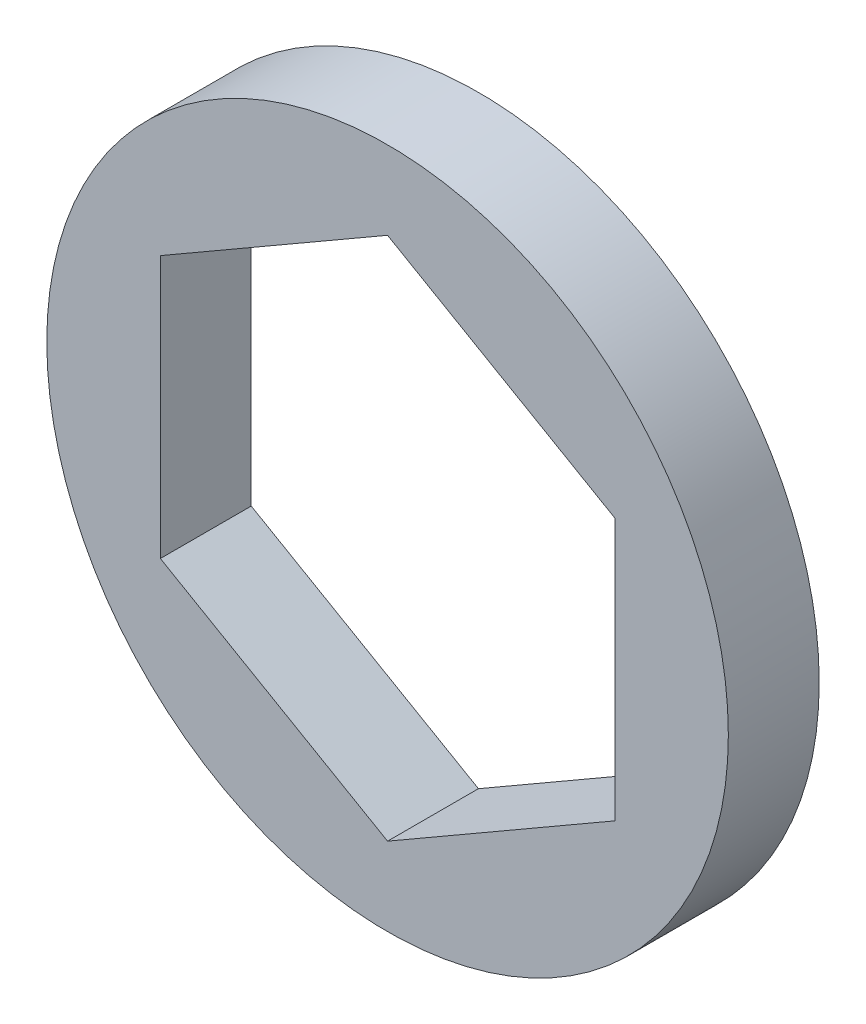
ISO-10303-21;
HEADER;
FILE_DESCRIPTION(('STEP AP214'),'2;1');
FILE_NAME('part.step','',(''),(''),'','','');
FILE_SCHEMA(('AUTOMOTIVE_DESIGN { 1 0 10303 214 1 1 1 1 }'));
ENDSEC;
DATA;
#1=APPLICATION_CONTEXT('core data for automotive mechanical design processes');
#2=APPLICATION_PROTOCOL_DEFINITION('international standard','automotive_design',2000,#1);
#3=PRODUCT_CONTEXT('',#1,'mechanical');
#4=PRODUCT('Part','Part','',(#3));
#5=PRODUCT_RELATED_PRODUCT_CATEGORY('part','',(#4));
#6=PRODUCT_DEFINITION_FORMATION('','',#4);
#7=PRODUCT_DEFINITION_CONTEXT('part definition',#1,'design');
#8=PRODUCT_DEFINITION('design','',#6,#7);
#9=PRODUCT_DEFINITION_SHAPE('','',#8);
#10=(LENGTH_UNIT() NAMED_UNIT(*) SI_UNIT(.MILLI.,.METRE.));
#11=(NAMED_UNIT(*) PLANE_ANGLE_UNIT() SI_UNIT($,.RADIAN.));
#12=(NAMED_UNIT(*) SI_UNIT($,.STERADIAN.) SOLID_ANGLE_UNIT());
#13=UNCERTAINTY_MEASURE_WITH_UNIT(LENGTH_MEASURE(1.E-05),#10,'distance_accuracy_value','');
#14=(GEOMETRIC_REPRESENTATION_CONTEXT(3) GLOBAL_UNCERTAINTY_ASSIGNED_CONTEXT((#13)) GLOBAL_UNIT_ASSIGNED_CONTEXT((#10,
#11,#12)) REPRESENTATION_CONTEXT('',''));
#15=CARTESIAN_POINT('',(0.,0.,0.));
#16=DIRECTION('',(0.,0.,1.));
#17=DIRECTION('',(1.,0.,0.));
#18=AXIS2_PLACEMENT_3D('',#15,#16,#17);
#19=CARTESIAN_POINT('',(114.3,627.126,2.54));
#20=DIRECTION('',(0.,0.,1.));
#21=DIRECTION('',(1.,0.,0.));
#22=AXIS2_PLACEMENT_3D('',#19,#20,#21);
#23=PLANE('',#22);
#24=CARTESIAN_POINT('',(114.3,627.126,2.54));
#25=DIRECTION('',(0.,0.,1.));
#26=DIRECTION('',(1.,0.,0.));
#27=AXIS2_PLACEMENT_3D('',#24,#25,#26);
#28=CIRCLE('',#27,9.525);
#29=CARTESIAN_POINT('',(123.825,627.126,2.54));
#30=VERTEX_POINT('',#29);
#31=EDGE_CURVE('E11',#30,#30,#28,.T.);
#32=ORIENTED_EDGE('',*,*,#31,.T.);
#33=EDGE_LOOP('',(#32));
#34=FACE_BOUND('',#33,.T.);
#35=DIRECTION('',(-0.866025403784437,-0.500000000000002,0.));
#36=VECTOR('',#35,1.);
#37=CARTESIAN_POINT('',(114.3,634.458348418708,2.54));
#38=LINE('',#37,#36);
#39=CARTESIAN_POINT('',(114.3,634.458348418708,2.54));
#40=VERTEX_POINT('',#39);
#41=CARTESIAN_POINT('',(107.95,630.792174209354,2.54));
#42=VERTEX_POINT('',#41);
#43=EDGE_CURVE('E100',#40,#42,#38,.T.);
#44=ORIENTED_EDGE('',*,*,#43,.F.);
#45=DIRECTION('',(-0.866025403784435,0.500000000000007,0.));
#46=VECTOR('',#45,1.);
#47=CARTESIAN_POINT('',(120.65,630.792174209354,2.54));
#48=LINE('',#47,#46);
#49=CARTESIAN_POINT('',(120.65,630.792174209354,2.54));
#50=VERTEX_POINT('',#49);
#51=EDGE_CURVE('E92',#50,#40,#48,.T.);
#52=ORIENTED_EDGE('',*,*,#51,.F.);
#53=DIRECTION('',(0.,1.,0.));
#54=VECTOR('',#53,1.);
#55=CARTESIAN_POINT('',(120.65,623.459825790646,2.54));
#56=LINE('',#55,#54);
#57=CARTESIAN_POINT('',(120.65,623.459825790646,2.54));
#58=VERTEX_POINT('',#57);
#59=EDGE_CURVE('E120',#58,#50,#56,.T.);
#60=ORIENTED_EDGE('',*,*,#59,.F.);
#61=DIRECTION('',(0.866025403784441,0.499999999999995,0.));
#62=VECTOR('',#61,1.);
#63=CARTESIAN_POINT('',(114.3,619.793651581292,2.54));
#64=LINE('',#63,#62);
#65=CARTESIAN_POINT('',(114.3,619.793651581292,2.54));
#66=VERTEX_POINT('',#65);
#67=EDGE_CURVE('E118',#66,#58,#64,.T.);
#68=ORIENTED_EDGE('',*,*,#67,.F.);
#69=DIRECTION('',(0.866025403784443,-0.499999999999992,0.));
#70=VECTOR('',#69,1.);
#71=CARTESIAN_POINT('',(107.95,623.459825790646,2.54));
#72=LINE('',#71,#70);
#73=CARTESIAN_POINT('',(107.95,623.459825790646,2.54));
#74=VERTEX_POINT('',#73);
#75=EDGE_CURVE('E114',#74,#66,#72,.T.);
#76=ORIENTED_EDGE('',*,*,#75,.F.);
#77=DIRECTION('',(0.,-1.,0.));
#78=VECTOR('',#77,1.);
#79=CARTESIAN_POINT('',(107.95,630.792174209354,2.54));
#80=LINE('',#79,#78);
#81=EDGE_CURVE('E112',#42,#74,#80,.T.);
#82=ORIENTED_EDGE('',*,*,#81,.F.);
#83=EDGE_LOOP('',(#44,#52,#60,#68,#76,#82));
#84=FACE_BOUND('',#83,.T.);
#85=ADVANCED_FACE('F39',(#34,#84),#23,.T.);
#86=CARTESIAN_POINT('',(114.3,627.126,0.));
#87=DIRECTION('',(0.,0.,1.));
#88=DIRECTION('',(1.,0.,0.));
#89=AXIS2_PLACEMENT_3D('',#86,#87,#88);
#90=PLANE('',#89);
#91=CARTESIAN_POINT('',(114.3,627.126,0.));
#92=DIRECTION('',(0.,0.,1.));
#93=DIRECTION('',(1.,0.,0.));
#94=AXIS2_PLACEMENT_3D('',#91,#92,#93);
#95=CIRCLE('',#94,9.525);
#96=CARTESIAN_POINT('',(123.825,627.126,0.));
#97=VERTEX_POINT('',#96);
#98=EDGE_CURVE('E43',#97,#97,#95,.T.);
#99=ORIENTED_EDGE('',*,*,#98,.F.);
#100=EDGE_LOOP('',(#99));
#101=FACE_BOUND('',#100,.T.);
#102=DIRECTION('',(-0.866025403784435,0.500000000000007,0.));
#103=VECTOR('',#102,1.);
#104=CARTESIAN_POINT('',(120.65,630.792174209354,0.));
#105=LINE('',#104,#103);
#106=CARTESIAN_POINT('',(120.65,630.792174209354,0.));
#107=VERTEX_POINT('',#106);
#108=CARTESIAN_POINT('',(114.3,634.458348418708,0.));
#109=VERTEX_POINT('',#108);
#110=EDGE_CURVE('E62',#107,#109,#105,.T.);
#111=ORIENTED_EDGE('',*,*,#110,.T.);
#112=DIRECTION('',(-0.866025403784437,-0.500000000000002,0.));
#113=VECTOR('',#112,1.);
#114=CARTESIAN_POINT('',(114.3,634.458348418708,0.));
#115=LINE('',#114,#113);
#116=CARTESIAN_POINT('',(107.95,630.792174209354,0.));
#117=VERTEX_POINT('',#116);
#118=EDGE_CURVE('E107',#109,#117,#115,.T.);
#119=ORIENTED_EDGE('',*,*,#118,.T.);
#120=DIRECTION('',(0.,-1.,0.));
#121=VECTOR('',#120,1.);
#122=CARTESIAN_POINT('',(107.95,630.792174209354,0.));
#123=LINE('',#122,#121);
#124=CARTESIAN_POINT('',(107.95,623.459825790646,0.));
#125=VERTEX_POINT('',#124);
#126=EDGE_CURVE('E124',#117,#125,#123,.T.);
#127=ORIENTED_EDGE('',*,*,#126,.T.);
#128=DIRECTION('',(0.866025403784443,-0.499999999999992,0.));
#129=VECTOR('',#128,1.);
#130=CARTESIAN_POINT('',(107.95,623.459825790646,0.));
#131=LINE('',#130,#129);
#132=CARTESIAN_POINT('',(114.3,619.793651581292,0.));
#133=VERTEX_POINT('',#132);
#134=EDGE_CURVE('E127',#125,#133,#131,.T.);
#135=ORIENTED_EDGE('',*,*,#134,.T.);
#136=DIRECTION('',(0.866025403784441,0.499999999999995,0.));
#137=VECTOR('',#136,1.);
#138=CARTESIAN_POINT('',(114.3,619.793651581292,0.));
#139=LINE('',#138,#137);
#140=CARTESIAN_POINT('',(120.65,623.459825790646,0.));
#141=VERTEX_POINT('',#140);
#142=EDGE_CURVE('E130',#133,#141,#139,.T.);
#143=ORIENTED_EDGE('',*,*,#142,.T.);
#144=DIRECTION('',(0.,1.,0.));
#145=VECTOR('',#144,1.);
#146=CARTESIAN_POINT('',(120.65,623.459825790646,0.));
#147=LINE('',#146,#145);
#148=EDGE_CURVE('E101',#141,#107,#147,.T.);
#149=ORIENTED_EDGE('',*,*,#148,.T.);
#150=EDGE_LOOP('',(#111,#119,#127,#135,#143,#149));
#151=FACE_BOUND('',#150,.T.);
#152=ADVANCED_FACE('F147',(#101,#151),#90,.F.);
#153=CARTESIAN_POINT('',(114.3,627.126,2.54));
#154=DIRECTION('',(0.,0.,-1.));
#155=DIRECTION('',(-1.,0.,0.));
#156=AXIS2_PLACEMENT_3D('',#153,#154,#155);
#157=CYLINDRICAL_SURFACE('',#156,9.525);
#158=ORIENTED_EDGE('',*,*,#31,.F.);
#159=EDGE_LOOP('',(#158));
#160=FACE_BOUND('',#159,.T.);
#161=ORIENTED_EDGE('',*,*,#98,.T.);
#162=EDGE_LOOP('',(#161));
#163=FACE_BOUND('',#162,.T.);
#164=ADVANCED_FACE('F41',(#160,#163),#157,.T.);
#165=CARTESIAN_POINT('',(120.65,630.792174209354,2.54));
#166=DIRECTION('',(-0.500000000000007,-0.866025403784435,0.));
#167=DIRECTION('',(0.866025403784435,-0.500000000000007,0.));
#168=AXIS2_PLACEMENT_3D('',#165,#166,#167);
#169=PLANE('',#168);
#170=ORIENTED_EDGE('',*,*,#110,.F.);
#171=DIRECTION('',(0.,0.,-1.));
#172=VECTOR('',#171,1.);
#173=CARTESIAN_POINT('',(120.65,630.792174209354,2.54));
#174=LINE('',#173,#172);
#175=EDGE_CURVE('E96',#50,#107,#174,.T.);
#176=ORIENTED_EDGE('',*,*,#175,.F.);
#177=ORIENTED_EDGE('',*,*,#51,.T.);
#178=DIRECTION('',(0.,0.,-1.));
#179=VECTOR('',#178,1.);
#180=CARTESIAN_POINT('',(114.3,634.458348418708,2.54));
#181=LINE('',#180,#179);
#182=EDGE_CURVE('E95',#40,#109,#181,.T.);
#183=ORIENTED_EDGE('',*,*,#182,.T.);
#184=EDGE_LOOP('',(#170,#176,#177,#183));
#185=FACE_BOUND('',#184,.T.);
#186=ADVANCED_FACE('F94',(#185),#169,.T.);
#187=CARTESIAN_POINT('',(114.3,634.458348418708,2.54));
#188=DIRECTION('',(0.500000000000002,-0.866025403784437,0.));
#189=DIRECTION('',(0.866025403784437,0.500000000000002,0.));
#190=AXIS2_PLACEMENT_3D('',#187,#188,#189);
#191=PLANE('',#190);
#192=ORIENTED_EDGE('',*,*,#118,.F.);
#193=ORIENTED_EDGE('',*,*,#182,.F.);
#194=ORIENTED_EDGE('',*,*,#43,.T.);
#195=DIRECTION('',(0.,0.,-1.));
#196=VECTOR('',#195,1.);
#197=CARTESIAN_POINT('',(107.95,630.792174209354,2.54));
#198=LINE('',#197,#196);
#199=EDGE_CURVE('E108',#42,#117,#198,.T.);
#200=ORIENTED_EDGE('',*,*,#199,.T.);
#201=EDGE_LOOP('',(#192,#193,#194,#200));
#202=FACE_BOUND('',#201,.T.);
#203=ADVANCED_FACE('F104',(#202),#191,.T.);
#204=CARTESIAN_POINT('',(107.95,630.792174209354,2.54));
#205=DIRECTION('',(1.,0.,0.));
#206=DIRECTION('',(0.,0.,-1.));
#207=AXIS2_PLACEMENT_3D('',#204,#205,#206);
#208=PLANE('',#207);
#209=ORIENTED_EDGE('',*,*,#126,.F.);
#210=ORIENTED_EDGE('',*,*,#199,.F.);
#211=ORIENTED_EDGE('',*,*,#81,.T.);
#212=DIRECTION('',(0.,0.,-1.));
#213=VECTOR('',#212,1.);
#214=CARTESIAN_POINT('',(107.95,623.459825790646,2.54));
#215=LINE('',#214,#213);
#216=EDGE_CURVE('E139',#74,#125,#215,.T.);
#217=ORIENTED_EDGE('',*,*,#216,.T.);
#218=EDGE_LOOP('',(#209,#210,#211,#217));
#219=FACE_BOUND('',#218,.T.);
#220=ADVANCED_FACE('F143',(#219),#208,.T.);
#221=CARTESIAN_POINT('',(107.95,623.459825790646,2.54));
#222=DIRECTION('',(0.499999999999992,0.866025403784443,0.));
#223=DIRECTION('',(-0.866025403784444,0.499999999999992,0.));
#224=AXIS2_PLACEMENT_3D('',#221,#222,#223);
#225=PLANE('',#224);
#226=ORIENTED_EDGE('',*,*,#134,.F.);
#227=ORIENTED_EDGE('',*,*,#216,.F.);
#228=ORIENTED_EDGE('',*,*,#75,.T.);
#229=DIRECTION('',(0.,0.,-1.));
#230=VECTOR('',#229,1.);
#231=CARTESIAN_POINT('',(114.3,619.793651581292,2.54));
#232=LINE('',#231,#230);
#233=EDGE_CURVE('E137',#66,#133,#232,.T.);
#234=ORIENTED_EDGE('',*,*,#233,.T.);
#235=EDGE_LOOP('',(#226,#227,#228,#234));
#236=FACE_BOUND('',#235,.T.);
#237=ADVANCED_FACE('F155',(#236),#225,.T.);
#238=CARTESIAN_POINT('',(114.3,619.793651581292,2.54));
#239=DIRECTION('',(-0.499999999999995,0.866025403784442,0.));
#240=DIRECTION('',(-0.866025403784442,-0.499999999999995,0.));
#241=AXIS2_PLACEMENT_3D('',#238,#239,#240);
#242=PLANE('',#241);
#243=ORIENTED_EDGE('',*,*,#142,.F.);
#244=ORIENTED_EDGE('',*,*,#233,.F.);
#245=ORIENTED_EDGE('',*,*,#67,.T.);
#246=DIRECTION('',(0.,0.,-1.));
#247=VECTOR('',#246,1.);
#248=CARTESIAN_POINT('',(120.65,623.459825790646,2.54));
#249=LINE('',#248,#247);
#250=EDGE_CURVE('E54',#58,#141,#249,.T.);
#251=ORIENTED_EDGE('',*,*,#250,.T.);
#252=EDGE_LOOP('',(#243,#244,#245,#251));
#253=FACE_BOUND('',#252,.T.);
#254=ADVANCED_FACE('F153',(#253),#242,.T.);
#255=CARTESIAN_POINT('',(120.65,623.459825790646,2.54));
#256=DIRECTION('',(-1.,0.,0.));
#257=DIRECTION('',(0.,0.,1.));
#258=AXIS2_PLACEMENT_3D('',#255,#256,#257);
#259=PLANE('',#258);
#260=ORIENTED_EDGE('',*,*,#148,.F.);
#261=ORIENTED_EDGE('',*,*,#250,.F.);
#262=ORIENTED_EDGE('',*,*,#59,.T.);
#263=ORIENTED_EDGE('',*,*,#175,.T.);
#264=EDGE_LOOP('',(#260,#261,#262,#263));
#265=FACE_BOUND('',#264,.T.);
#266=ADVANCED_FACE('F149',(#265),#259,.T.);
#267=CLOSED_SHELL('',(#85,#152,#164,#186,#203,#220,#237,#254,#266));
#268=MANIFOLD_SOLID_BREP('B2',#267);
#269=ADVANCED_BREP_SHAPE_REPRESENTATION('',(#18,#268),#14);
#270=SHAPE_DEFINITION_REPRESENTATION(#9,#269);
ENDSEC;
END-ISO-10303-21;
